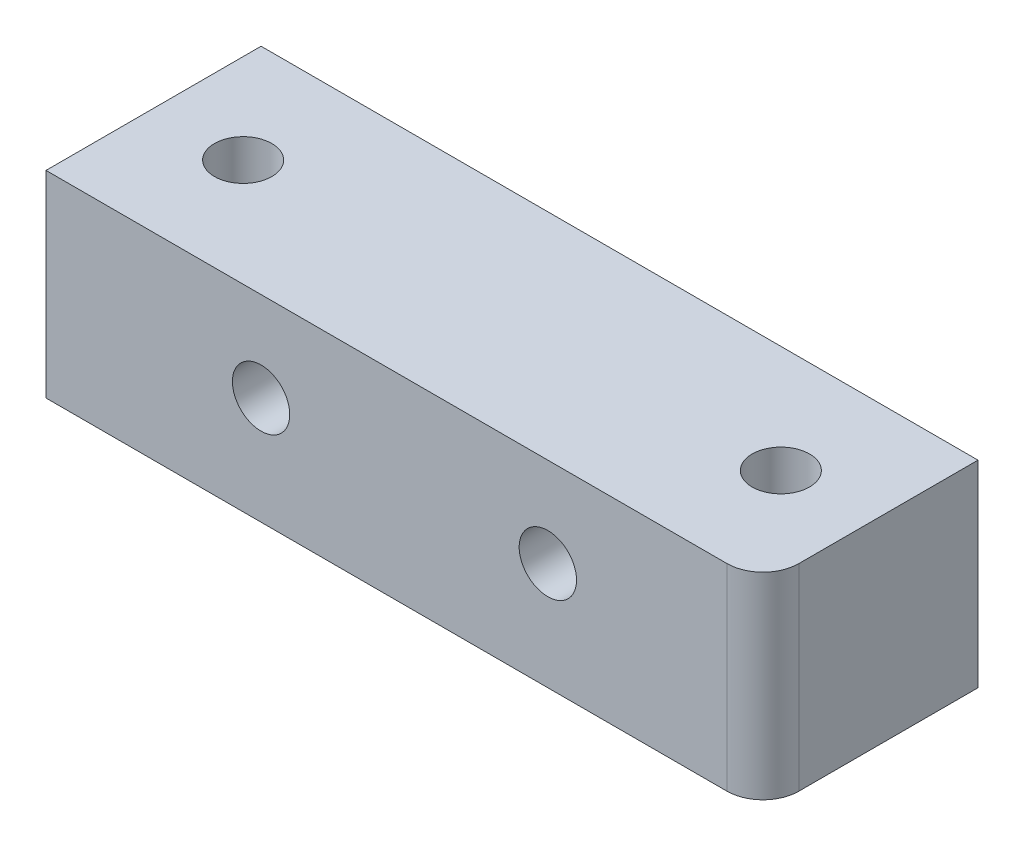
ISO-10303-21;
HEADER;
FILE_DESCRIPTION(('STEP AP214'),'2;1');
FILE_NAME('part.step','',(''),(''),'','','');
FILE_SCHEMA(('AUTOMOTIVE_DESIGN { 1 0 10303 214 1 1 1 1 }'));
ENDSEC;
DATA;
#1=APPLICATION_CONTEXT('core data for automotive mechanical design processes');
#2=APPLICATION_PROTOCOL_DEFINITION('international standard','automotive_design',2000,#1);
#3=PRODUCT_CONTEXT('',#1,'mechanical');
#4=PRODUCT('Part','Part','',(#3));
#5=PRODUCT_RELATED_PRODUCT_CATEGORY('part','',(#4));
#6=PRODUCT_DEFINITION_FORMATION('','',#4);
#7=PRODUCT_DEFINITION_CONTEXT('part definition',#1,'design');
#8=PRODUCT_DEFINITION('design','',#6,#7);
#9=PRODUCT_DEFINITION_SHAPE('','',#8);
#10=(LENGTH_UNIT() NAMED_UNIT(*) SI_UNIT(.MILLI.,.METRE.));
#11=(NAMED_UNIT(*) PLANE_ANGLE_UNIT() SI_UNIT($,.RADIAN.));
#12=(NAMED_UNIT(*) SI_UNIT($,.STERADIAN.) SOLID_ANGLE_UNIT());
#13=UNCERTAINTY_MEASURE_WITH_UNIT(LENGTH_MEASURE(1.E-05),#10,'distance_accuracy_value','');
#14=(GEOMETRIC_REPRESENTATION_CONTEXT(3) GLOBAL_UNCERTAINTY_ASSIGNED_CONTEXT((#13)) GLOBAL_UNIT_ASSIGNED_CONTEXT((#10,
#11,#12)) REPRESENTATION_CONTEXT('',''));
#15=CARTESIAN_POINT('',(0.,0.,0.));
#16=DIRECTION('',(0.,0.,1.));
#17=DIRECTION('',(1.,0.,0.));
#18=AXIS2_PLACEMENT_3D('',#15,#16,#17);
#19=CARTESIAN_POINT('',(10.,-5.5,3.));
#20=DIRECTION('',(1.,0.,0.));
#21=DIRECTION('',(0.,0.,-1.));
#22=AXIS2_PLACEMENT_3D('',#19,#20,#21);
#23=PLANE('',#22);
#24=DIRECTION('',(0.,0.,-1.));
#25=VECTOR('',#24,1.);
#26=CARTESIAN_POINT('',(10.,0.,3.));
#27=LINE('',#26,#25);
#28=CARTESIAN_POINT('',(10.,0.,2.));
#29=VERTEX_POINT('',#28);
#30=CARTESIAN_POINT('',(10.,0.,-3.));
#31=VERTEX_POINT('',#30);
#32=EDGE_CURVE('E106',#29,#31,#27,.T.);
#33=ORIENTED_EDGE('',*,*,#32,.F.);
#34=DIRECTION('',(0.,1.,0.));
#35=VECTOR('',#34,1.);
#36=CARTESIAN_POINT('',(10.,-5.5,2.));
#37=LINE('',#36,#35);
#38=CARTESIAN_POINT('',(10.,-5.5,2.));
#39=VERTEX_POINT('',#38);
#40=EDGE_CURVE('E42',#29,#39,#37,.F.);
#41=ORIENTED_EDGE('',*,*,#40,.T.);
#42=DIRECTION('',(0.,0.,-1.));
#43=VECTOR('',#42,1.);
#44=CARTESIAN_POINT('',(10.,-5.5,3.));
#45=LINE('',#44,#43);
#46=CARTESIAN_POINT('',(10.,-5.5,-3.));
#47=VERTEX_POINT('',#46);
#48=EDGE_CURVE('E77',#39,#47,#45,.T.);
#49=ORIENTED_EDGE('',*,*,#48,.T.);
#50=DIRECTION('',(0.,1.,0.));
#51=VECTOR('',#50,1.);
#52=CARTESIAN_POINT('',(10.,-5.5,-3.));
#53=LINE('',#52,#51);
#54=EDGE_CURVE('E79',#47,#31,#53,.T.);
#55=ORIENTED_EDGE('',*,*,#54,.T.);
#56=EDGE_LOOP('',(#33,#41,#49,#55));
#57=FACE_BOUND('',#56,.T.);
#58=ADVANCED_FACE('F34',(#57),#23,.T.);
#59=CARTESIAN_POINT('',(-10.,-5.5,3.));
#60=DIRECTION('',(0.,0.,1.));
#61=DIRECTION('',(1.,0.,0.));
#62=AXIS2_PLACEMENT_3D('',#59,#60,#61);
#63=PLANE('',#62);
#64=CARTESIAN_POINT('',(-4.,-2.5,3.));
#65=DIRECTION('',(0.,0.,1.));
#66=DIRECTION('',(1.,0.,0.));
#67=AXIS2_PLACEMENT_3D('',#64,#65,#66);
#68=CIRCLE('',#67,0.799999999999999);
#69=CARTESIAN_POINT('',(-3.2,-2.5,3.));
#70=VERTEX_POINT('',#69);
#71=EDGE_CURVE('E170',#70,#70,#68,.T.);
#72=ORIENTED_EDGE('',*,*,#71,.F.);
#73=EDGE_LOOP('',(#72));
#74=FACE_BOUND('',#73,.T.);
#75=CARTESIAN_POINT('',(4.,-2.5,3.));
#76=DIRECTION('',(0.,0.,1.));
#77=DIRECTION('',(1.,0.,0.));
#78=AXIS2_PLACEMENT_3D('',#75,#76,#77);
#79=CIRCLE('',#78,0.799999999999999);
#80=CARTESIAN_POINT('',(4.8,-2.5,3.));
#81=VERTEX_POINT('',#80);
#82=EDGE_CURVE('E174',#81,#81,#79,.T.);
#83=ORIENTED_EDGE('',*,*,#82,.F.);
#84=EDGE_LOOP('',(#83));
#85=FACE_BOUND('',#84,.T.);
#86=DIRECTION('',(1.,0.,0.));
#87=VECTOR('',#86,1.);
#88=CARTESIAN_POINT('',(-10.,-5.5,3.));
#89=LINE('',#88,#87);
#90=CARTESIAN_POINT('',(-10.,-5.5,3.));
#91=VERTEX_POINT('',#90);
#92=CARTESIAN_POINT('',(9.,-5.5,3.));
#93=VERTEX_POINT('',#92);
#94=EDGE_CURVE('E93',#91,#93,#89,.T.);
#95=ORIENTED_EDGE('',*,*,#94,.T.);
#96=DIRECTION('',(0.,1.,0.));
#97=VECTOR('',#96,1.);
#98=CARTESIAN_POINT('',(9.,-5.5,3.));
#99=LINE('',#98,#97);
#100=CARTESIAN_POINT('',(9.,0.,3.));
#101=VERTEX_POINT('',#100);
#102=EDGE_CURVE('E116',#93,#101,#99,.T.);
#103=ORIENTED_EDGE('',*,*,#102,.T.);
#104=DIRECTION('',(1.,0.,0.));
#105=VECTOR('',#104,1.);
#106=CARTESIAN_POINT('',(-10.,0.,3.));
#107=LINE('',#106,#105);
#108=CARTESIAN_POINT('',(-10.,0.,3.));
#109=VERTEX_POINT('',#108);
#110=EDGE_CURVE('E85',#109,#101,#107,.T.);
#111=ORIENTED_EDGE('',*,*,#110,.F.);
#112=DIRECTION('',(0.,1.,0.));
#113=VECTOR('',#112,1.);
#114=CARTESIAN_POINT('',(-10.,-5.5,3.));
#115=LINE('',#114,#113);
#116=EDGE_CURVE('E114',#91,#109,#115,.T.);
#117=ORIENTED_EDGE('',*,*,#116,.F.);
#118=EDGE_LOOP('',(#95,#103,#111,#117));
#119=FACE_BOUND('',#118,.T.);
#120=ADVANCED_FACE('F123',(#74,#85,#119),#63,.T.);
#121=CARTESIAN_POINT('',(-10.,-5.5,3.));
#122=DIRECTION('',(-1.,0.,0.));
#123=DIRECTION('',(0.,0.,1.));
#124=AXIS2_PLACEMENT_3D('',#121,#122,#123);
#125=PLANE('',#124);
#126=DIRECTION('',(0.,0.,1.));
#127=VECTOR('',#126,1.);
#128=CARTESIAN_POINT('',(-10.,0.,3.));
#129=LINE('',#128,#127);
#130=CARTESIAN_POINT('',(-10.,0.,-3.));
#131=VERTEX_POINT('',#130);
#132=EDGE_CURVE('E110',#131,#109,#129,.T.);
#133=ORIENTED_EDGE('',*,*,#132,.F.);
#134=DIRECTION('',(0.,1.,0.));
#135=VECTOR('',#134,1.);
#136=CARTESIAN_POINT('',(-10.,-5.5,-3.));
#137=LINE('',#136,#135);
#138=CARTESIAN_POINT('',(-10.,-5.5,-3.));
#139=VERTEX_POINT('',#138);
#140=EDGE_CURVE('E92',#139,#131,#137,.T.);
#141=ORIENTED_EDGE('',*,*,#140,.F.);
#142=DIRECTION('',(0.,0.,1.));
#143=VECTOR('',#142,1.);
#144=CARTESIAN_POINT('',(-10.,-5.5,3.));
#145=LINE('',#144,#143);
#146=EDGE_CURVE('E99',#139,#91,#145,.T.);
#147=ORIENTED_EDGE('',*,*,#146,.T.);
#148=ORIENTED_EDGE('',*,*,#116,.T.);
#149=EDGE_LOOP('',(#133,#141,#147,#148));
#150=FACE_BOUND('',#149,.T.);
#151=ADVANCED_FACE('F128',(#150),#125,.T.);
#152=CARTESIAN_POINT('',(-10.,-5.5,-3.));
#153=DIRECTION('',(0.,0.,-1.));
#154=DIRECTION('',(-1.,0.,0.));
#155=AXIS2_PLACEMENT_3D('',#152,#153,#154);
#156=PLANE('',#155);
#157=CARTESIAN_POINT('',(-4.,-2.5,-3.));
#158=DIRECTION('',(0.,0.,-1.));
#159=DIRECTION('',(-1.,0.,0.));
#160=AXIS2_PLACEMENT_3D('',#157,#158,#159);
#161=CIRCLE('',#160,0.799999999999999);
#162=CARTESIAN_POINT('',(-4.8,-2.5,-3.));
#163=VERTEX_POINT('',#162);
#164=EDGE_CURVE('E173',#163,#163,#161,.T.);
#165=ORIENTED_EDGE('',*,*,#164,.F.);
#166=EDGE_LOOP('',(#165));
#167=FACE_BOUND('',#166,.T.);
#168=CARTESIAN_POINT('',(4.,-2.5,-3.));
#169=DIRECTION('',(0.,0.,-1.));
#170=DIRECTION('',(-1.,0.,0.));
#171=AXIS2_PLACEMENT_3D('',#168,#169,#170);
#172=CIRCLE('',#171,0.799999999999999);
#173=CARTESIAN_POINT('',(3.2,-2.5,-3.));
#174=VERTEX_POINT('',#173);
#175=EDGE_CURVE('E177',#174,#174,#172,.T.);
#176=ORIENTED_EDGE('',*,*,#175,.F.);
#177=EDGE_LOOP('',(#176));
#178=FACE_BOUND('',#177,.T.);
#179=DIRECTION('',(-1.,0.,0.));
#180=VECTOR('',#179,1.);
#181=CARTESIAN_POINT('',(-10.,0.,-3.));
#182=LINE('',#181,#180);
#183=EDGE_CURVE('E91',#31,#131,#182,.T.);
#184=ORIENTED_EDGE('',*,*,#183,.F.);
#185=ORIENTED_EDGE('',*,*,#54,.F.);
#186=DIRECTION('',(-1.,0.,0.));
#187=VECTOR('',#186,1.);
#188=CARTESIAN_POINT('',(-10.,-5.5,-3.));
#189=LINE('',#188,#187);
#190=EDGE_CURVE('E84',#47,#139,#189,.T.);
#191=ORIENTED_EDGE('',*,*,#190,.T.);
#192=ORIENTED_EDGE('',*,*,#140,.T.);
#193=EDGE_LOOP('',(#184,#185,#191,#192));
#194=FACE_BOUND('',#193,.T.);
#195=ADVANCED_FACE('F89',(#167,#178,#194),#156,.T.);
#196=CARTESIAN_POINT('',(10.,-5.5,-3.));
#197=DIRECTION('',(0.,-1.,0.));
#198=DIRECTION('',(0.,0.,-1.));
#199=AXIS2_PLACEMENT_3D('',#196,#197,#198);
#200=PLANE('',#199);
#201=CARTESIAN_POINT('',(-7.5,-5.5,0.));
#202=DIRECTION('',(0.,-1.,0.));
#203=DIRECTION('',(0.,0.,-1.));
#204=AXIS2_PLACEMENT_3D('',#201,#202,#203);
#205=CIRCLE('',#204,0.799999999999999);
#206=CARTESIAN_POINT('',(-7.5,-5.5,-0.799999999999999));
#207=VERTEX_POINT('',#206);
#208=EDGE_CURVE('E186',#207,#207,#205,.T.);
#209=ORIENTED_EDGE('',*,*,#208,.F.);
#210=EDGE_LOOP('',(#209));
#211=FACE_BOUND('',#210,.T.);
#212=CARTESIAN_POINT('',(7.5,-5.5,0.));
#213=DIRECTION('',(0.,-1.,0.));
#214=DIRECTION('',(0.,0.,-1.));
#215=AXIS2_PLACEMENT_3D('',#212,#213,#214);
#216=CIRCLE('',#215,0.799999999999999);
#217=CARTESIAN_POINT('',(7.5,-5.5,-0.799999999999999));
#218=VERTEX_POINT('',#217);
#219=EDGE_CURVE('E108',#218,#218,#216,.T.);
#220=ORIENTED_EDGE('',*,*,#219,.F.);
#221=EDGE_LOOP('',(#220));
#222=FACE_BOUND('',#221,.T.);
#223=ORIENTED_EDGE('',*,*,#48,.F.);
#224=CARTESIAN_POINT('',(9.,-5.5,2.));
#225=DIRECTION('',(0.,-1.,0.));
#226=DIRECTION('',(0.,0.,-1.));
#227=AXIS2_PLACEMENT_3D('',#224,#225,#226);
#228=CIRCLE('',#227,1.);
#229=EDGE_CURVE('E11',#39,#93,#228,.T.);
#230=ORIENTED_EDGE('',*,*,#229,.T.);
#231=ORIENTED_EDGE('',*,*,#94,.F.);
#232=ORIENTED_EDGE('',*,*,#146,.F.);
#233=ORIENTED_EDGE('',*,*,#190,.F.);
#234=EDGE_LOOP('',(#223,#230,#231,#232,#233));
#235=FACE_BOUND('',#234,.T.);
#236=ADVANCED_FACE('F96',(#211,#222,#235),#200,.T.);
#237=CARTESIAN_POINT('',(10.,0.,-3.));
#238=DIRECTION('',(0.,-1.,0.));
#239=DIRECTION('',(0.,0.,-1.));
#240=AXIS2_PLACEMENT_3D('',#237,#238,#239);
#241=PLANE('',#240);
#242=CARTESIAN_POINT('',(-7.5,0.,0.));
#243=DIRECTION('',(0.,1.,0.));
#244=DIRECTION('',(0.,0.,1.));
#245=AXIS2_PLACEMENT_3D('',#242,#243,#244);
#246=CIRCLE('',#245,0.799999999999999);
#247=CARTESIAN_POINT('',(-7.5,0.,0.799999999999999));
#248=VERTEX_POINT('',#247);
#249=EDGE_CURVE('E183',#248,#248,#246,.T.);
#250=ORIENTED_EDGE('',*,*,#249,.F.);
#251=EDGE_LOOP('',(#250));
#252=FACE_BOUND('',#251,.T.);
#253=CARTESIAN_POINT('',(7.5,0.,0.));
#254=DIRECTION('',(0.,1.,0.));
#255=DIRECTION('',(0.,0.,1.));
#256=AXIS2_PLACEMENT_3D('',#253,#254,#255);
#257=CIRCLE('',#256,0.799999999999999);
#258=CARTESIAN_POINT('',(7.5,0.,0.799999999999999));
#259=VERTEX_POINT('',#258);
#260=EDGE_CURVE('E189',#259,#259,#257,.T.);
#261=ORIENTED_EDGE('',*,*,#260,.F.);
#262=EDGE_LOOP('',(#261));
#263=FACE_BOUND('',#262,.T.);
#264=ORIENTED_EDGE('',*,*,#110,.T.);
#265=CARTESIAN_POINT('',(9.,0.,2.));
#266=DIRECTION('',(0.,-1.,0.));
#267=DIRECTION('',(0.,0.,-1.));
#268=AXIS2_PLACEMENT_3D('',#265,#266,#267);
#269=CIRCLE('',#268,1.);
#270=EDGE_CURVE('E56',#101,#29,#269,.F.);
#271=ORIENTED_EDGE('',*,*,#270,.T.);
#272=ORIENTED_EDGE('',*,*,#32,.T.);
#273=ORIENTED_EDGE('',*,*,#183,.T.);
#274=ORIENTED_EDGE('',*,*,#132,.T.);
#275=EDGE_LOOP('',(#264,#271,#272,#273,#274));
#276=FACE_BOUND('',#275,.T.);
#277=ADVANCED_FACE('F125',(#252,#263,#276),#241,.F.);
#278=CARTESIAN_POINT('',(7.5,0.,0.));
#279=DIRECTION('',(0.,1.,0.));
#280=DIRECTION('',(0.,0.,1.));
#281=AXIS2_PLACEMENT_3D('',#278,#279,#280);
#282=CYLINDRICAL_SURFACE('',#281,0.799999999999999);
#283=ORIENTED_EDGE('',*,*,#260,.T.);
#284=EDGE_LOOP('',(#283));
#285=FACE_BOUND('',#284,.T.);
#286=ORIENTED_EDGE('',*,*,#219,.T.);
#287=EDGE_LOOP('',(#286));
#288=FACE_BOUND('',#287,.T.);
#289=ADVANCED_FACE('F139',(#285,#288),#282,.F.);
#290=CARTESIAN_POINT('',(-7.5,0.,0.));
#291=DIRECTION('',(0.,1.,0.));
#292=DIRECTION('',(0.,0.,1.));
#293=AXIS2_PLACEMENT_3D('',#290,#291,#292);
#294=CYLINDRICAL_SURFACE('',#293,0.799999999999999);
#295=ORIENTED_EDGE('',*,*,#249,.T.);
#296=EDGE_LOOP('',(#295));
#297=FACE_BOUND('',#296,.T.);
#298=ORIENTED_EDGE('',*,*,#208,.T.);
#299=EDGE_LOOP('',(#298));
#300=FACE_BOUND('',#299,.T.);
#301=ADVANCED_FACE('F131',(#297,#300),#294,.F.);
#302=CARTESIAN_POINT('',(9.,-5.5,2.));
#303=DIRECTION('',(0.,1.,0.));
#304=DIRECTION('',(0.,0.,1.));
#305=AXIS2_PLACEMENT_3D('',#302,#303,#304);
#306=CYLINDRICAL_SURFACE('',#305,1.);
#307=ORIENTED_EDGE('',*,*,#229,.F.);
#308=ORIENTED_EDGE('',*,*,#40,.F.);
#309=ORIENTED_EDGE('',*,*,#270,.F.);
#310=ORIENTED_EDGE('',*,*,#102,.F.);
#311=EDGE_LOOP('',(#307,#308,#309,#310));
#312=FACE_BOUND('',#311,.T.);
#313=ADVANCED_FACE('F36',(#312),#306,.T.);
#314=CARTESIAN_POINT('',(4.,-2.5,3.));
#315=DIRECTION('',(0.,0.,1.));
#316=DIRECTION('',(1.,0.,0.));
#317=AXIS2_PLACEMENT_3D('',#314,#315,#316);
#318=CYLINDRICAL_SURFACE('',#317,0.799999999999999);
#319=ORIENTED_EDGE('',*,*,#82,.T.);
#320=EDGE_LOOP('',(#319));
#321=FACE_BOUND('',#320,.T.);
#322=ORIENTED_EDGE('',*,*,#175,.T.);
#323=EDGE_LOOP('',(#322));
#324=FACE_BOUND('',#323,.T.);
#325=ADVANCED_FACE('F130',(#321,#324),#318,.F.);
#326=CARTESIAN_POINT('',(-4.,-2.5,3.));
#327=DIRECTION('',(0.,0.,1.));
#328=DIRECTION('',(1.,0.,0.));
#329=AXIS2_PLACEMENT_3D('',#326,#327,#328);
#330=CYLINDRICAL_SURFACE('',#329,0.799999999999999);
#331=ORIENTED_EDGE('',*,*,#71,.T.);
#332=EDGE_LOOP('',(#331));
#333=FACE_BOUND('',#332,.T.);
#334=ORIENTED_EDGE('',*,*,#164,.T.);
#335=EDGE_LOOP('',(#334));
#336=FACE_BOUND('',#335,.T.);
#337=ADVANCED_FACE('F136',(#333,#336),#330,.F.);
#338=CLOSED_SHELL('',(#58,#120,#151,#195,#236,#277,#289,#301,#313,#325,#337));
#339=MANIFOLD_SOLID_BREP('B2',#338);
#340=ADVANCED_BREP_SHAPE_REPRESENTATION('',(#18,#339),#14);
#341=SHAPE_DEFINITION_REPRESENTATION(#9,#340);
ENDSEC;
END-ISO-10303-21;
